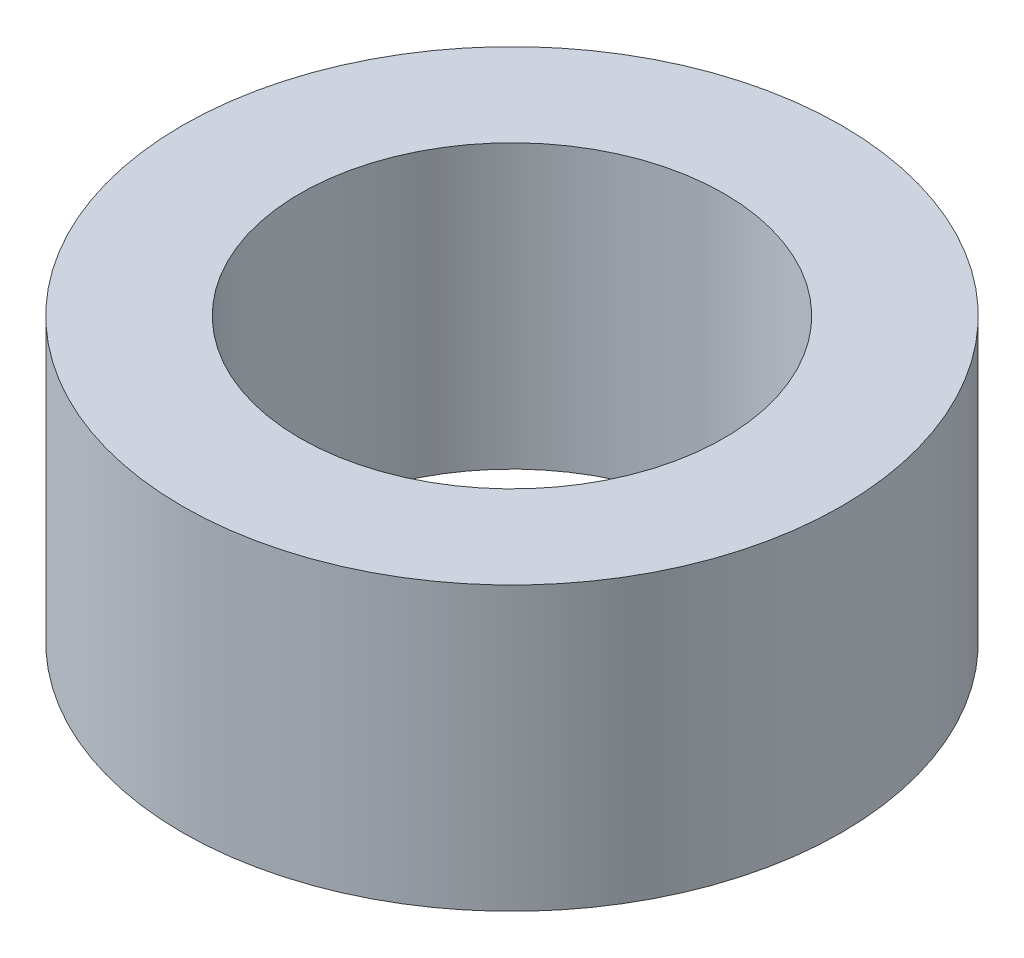
ISO-10303-21;
HEADER;
FILE_DESCRIPTION(('STEP AP214'),'2;1');
FILE_NAME('part.step','',(''),(''),'','','');
FILE_SCHEMA(('AUTOMOTIVE_DESIGN { 1 0 10303 214 1 1 1 1 }'));
ENDSEC;
DATA;
#1=APPLICATION_CONTEXT('core data for automotive mechanical design processes');
#2=APPLICATION_PROTOCOL_DEFINITION('international standard','automotive_design',2000,#1);
#3=PRODUCT_CONTEXT('',#1,'mechanical');
#4=PRODUCT('Part','Part','',(#3));
#5=PRODUCT_RELATED_PRODUCT_CATEGORY('part','',(#4));
#6=PRODUCT_DEFINITION_FORMATION('','',#4);
#7=PRODUCT_DEFINITION_CONTEXT('part definition',#1,'design');
#8=PRODUCT_DEFINITION('design','',#6,#7);
#9=PRODUCT_DEFINITION_SHAPE('','',#8);
#10=(LENGTH_UNIT() NAMED_UNIT(*) SI_UNIT(.MILLI.,.METRE.));
#11=(NAMED_UNIT(*) PLANE_ANGLE_UNIT() SI_UNIT($,.RADIAN.));
#12=(NAMED_UNIT(*) SI_UNIT($,.STERADIAN.) SOLID_ANGLE_UNIT());
#13=UNCERTAINTY_MEASURE_WITH_UNIT(LENGTH_MEASURE(1.E-05),#10,'distance_accuracy_value','');
#14=(GEOMETRIC_REPRESENTATION_CONTEXT(3) GLOBAL_UNCERTAINTY_ASSIGNED_CONTEXT((#13)) GLOBAL_UNIT_ASSIGNED_CONTEXT((#10,
#11,#12)) REPRESENTATION_CONTEXT('',''));
#15=CARTESIAN_POINT('',(0.,0.,0.));
#16=DIRECTION('',(0.,0.,1.));
#17=DIRECTION('',(1.,0.,0.));
#18=AXIS2_PLACEMENT_3D('',#15,#16,#17);
#19=CARTESIAN_POINT('',(0.,3.,0.));
#20=DIRECTION('',(0.,1.,0.));
#21=DIRECTION('',(0.,0.,1.));
#22=AXIS2_PLACEMENT_3D('',#19,#20,#21);
#23=PLANE('',#22);
#24=CARTESIAN_POINT('',(0.,3.,0.));
#25=DIRECTION('',(0.,1.,0.));
#26=DIRECTION('',(0.,0.,1.));
#27=AXIS2_PLACEMENT_3D('',#24,#25,#26);
#28=CIRCLE('',#27,3.5);
#29=CARTESIAN_POINT('',(0.,3.,3.5));
#30=VERTEX_POINT('',#29);
#31=EDGE_CURVE('E10',#30,#30,#28,.T.);
#32=ORIENTED_EDGE('',*,*,#31,.T.);
#33=EDGE_LOOP('',(#32));
#34=FACE_BOUND('',#33,.T.);
#35=CARTESIAN_POINT('',(0.,3.,0.));
#36=DIRECTION('',(0.,1.,0.));
#37=DIRECTION('',(0.,0.,1.));
#38=AXIS2_PLACEMENT_3D('',#35,#36,#37);
#39=CIRCLE('',#38,2.25);
#40=CARTESIAN_POINT('',(0.,3.,2.25));
#41=VERTEX_POINT('',#40);
#42=EDGE_CURVE('E57',#41,#41,#39,.T.);
#43=ORIENTED_EDGE('',*,*,#42,.F.);
#44=EDGE_LOOP('',(#43));
#45=FACE_BOUND('',#44,.T.);
#46=ADVANCED_FACE('F43',(#34,#45),#23,.T.);
#47=CARTESIAN_POINT('',(0.,0.,0.));
#48=DIRECTION('',(0.,1.,0.));
#49=DIRECTION('',(0.,0.,1.));
#50=AXIS2_PLACEMENT_3D('',#47,#48,#49);
#51=PLANE('',#50);
#52=CARTESIAN_POINT('',(0.,0.,0.));
#53=DIRECTION('',(0.,1.,0.));
#54=DIRECTION('',(0.,0.,1.));
#55=AXIS2_PLACEMENT_3D('',#52,#53,#54);
#56=CIRCLE('',#55,3.5);
#57=CARTESIAN_POINT('',(0.,0.,3.5));
#58=VERTEX_POINT('',#57);
#59=EDGE_CURVE('E50',#58,#58,#56,.T.);
#60=ORIENTED_EDGE('',*,*,#59,.F.);
#61=EDGE_LOOP('',(#60));
#62=FACE_BOUND('',#61,.T.);
#63=CARTESIAN_POINT('',(0.,0.,0.));
#64=DIRECTION('',(0.,1.,0.));
#65=DIRECTION('',(0.,0.,1.));
#66=AXIS2_PLACEMENT_3D('',#63,#64,#65);
#67=CIRCLE('',#66,2.25);
#68=CARTESIAN_POINT('',(0.,0.,2.25));
#69=VERTEX_POINT('',#68);
#70=EDGE_CURVE('E59',#69,#69,#67,.T.);
#71=ORIENTED_EDGE('',*,*,#70,.T.);
#72=EDGE_LOOP('',(#71));
#73=FACE_BOUND('',#72,.T.);
#74=ADVANCED_FACE('F67',(#62,#73),#51,.F.);
#75=CARTESIAN_POINT('',(0.,3.,0.));
#76=DIRECTION('',(0.,-1.,0.));
#77=DIRECTION('',(0.,0.,-1.));
#78=AXIS2_PLACEMENT_3D('',#75,#76,#77);
#79=CYLINDRICAL_SURFACE('',#78,3.5);
#80=ORIENTED_EDGE('',*,*,#31,.F.);
#81=EDGE_LOOP('',(#80));
#82=FACE_BOUND('',#81,.T.);
#83=ORIENTED_EDGE('',*,*,#59,.T.);
#84=EDGE_LOOP('',(#83));
#85=FACE_BOUND('',#84,.T.);
#86=ADVANCED_FACE('F44',(#82,#85),#79,.T.);
#87=CARTESIAN_POINT('',(0.,3.,0.));
#88=DIRECTION('',(0.,-1.,0.));
#89=DIRECTION('',(0.,0.,-1.));
#90=AXIS2_PLACEMENT_3D('',#87,#88,#89);
#91=CYLINDRICAL_SURFACE('',#90,2.25);
#92=ORIENTED_EDGE('',*,*,#42,.T.);
#93=EDGE_LOOP('',(#92));
#94=FACE_BOUND('',#93,.T.);
#95=ORIENTED_EDGE('',*,*,#70,.F.);
#96=EDGE_LOOP('',(#95));
#97=FACE_BOUND('',#96,.T.);
#98=ADVANCED_FACE('F69',(#94,#97),#91,.F.);
#99=CLOSED_SHELL('',(#46,#74,#86,#98));
#100=MANIFOLD_SOLID_BREP('B2',#99);
#101=ADVANCED_BREP_SHAPE_REPRESENTATION('',(#18,#100),#14);
#102=SHAPE_DEFINITION_REPRESENTATION(#9,#101);
ENDSEC;
END-ISO-10303-21;
